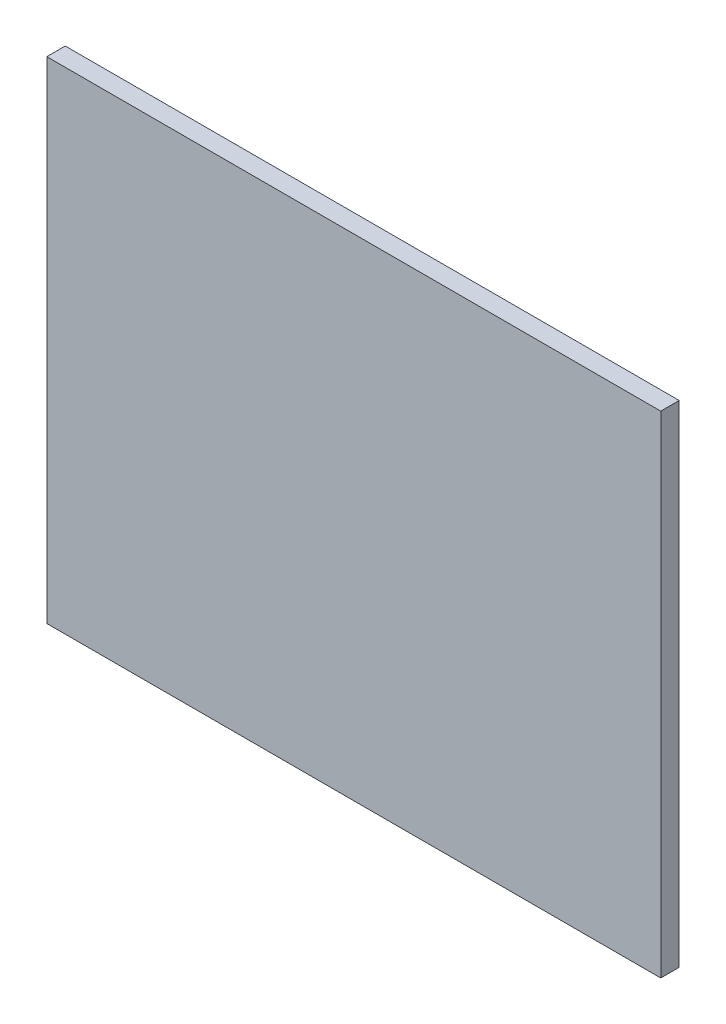
ISO-10303-21;
HEADER;
FILE_DESCRIPTION(('STEP AP214'),'2;1');
FILE_NAME('part.step','',(''),(''),'','','');
FILE_SCHEMA(('AUTOMOTIVE_DESIGN { 1 0 10303 214 1 1 1 1 }'));
ENDSEC;
DATA;
#1=APPLICATION_CONTEXT('core data for automotive mechanical design processes');
#2=APPLICATION_PROTOCOL_DEFINITION('international standard','automotive_design',2000,#1);
#3=PRODUCT_CONTEXT('',#1,'mechanical');
#4=PRODUCT('Part','Part','',(#3));
#5=PRODUCT_RELATED_PRODUCT_CATEGORY('part','',(#4));
#6=PRODUCT_DEFINITION_FORMATION('','',#4);
#7=PRODUCT_DEFINITION_CONTEXT('part definition',#1,'design');
#8=PRODUCT_DEFINITION('design','',#6,#7);
#9=PRODUCT_DEFINITION_SHAPE('','',#8);
#10=(LENGTH_UNIT() NAMED_UNIT(*) SI_UNIT(.MILLI.,.METRE.));
#11=(NAMED_UNIT(*) PLANE_ANGLE_UNIT() SI_UNIT($,.RADIAN.));
#12=(NAMED_UNIT(*) SI_UNIT($,.STERADIAN.) SOLID_ANGLE_UNIT());
#13=UNCERTAINTY_MEASURE_WITH_UNIT(LENGTH_MEASURE(1.E-05),#10,'distance_accuracy_value','');
#14=(GEOMETRIC_REPRESENTATION_CONTEXT(3) GLOBAL_UNCERTAINTY_ASSIGNED_CONTEXT((#13)) GLOBAL_UNIT_ASSIGNED_CONTEXT((#10,
#11,#12)) REPRESENTATION_CONTEXT('',''));
#15=CARTESIAN_POINT('',(0.,0.,0.));
#16=DIRECTION('',(0.,0.,1.));
#17=DIRECTION('',(1.,0.,0.));
#18=AXIS2_PLACEMENT_3D('',#15,#16,#17);
#19=CARTESIAN_POINT('',(0.,0.,3.));
#20=DIRECTION('',(1.,0.,0.));
#21=DIRECTION('',(0.,1.,0.));
#22=AXIS2_PLACEMENT_3D('',#19,#20,#21);
#23=PLANE('',#22);
#24=DIRECTION('',(0.,-1.,0.));
#25=VECTOR('',#24,1.);
#26=CARTESIAN_POINT('',(0.,0.,0.));
#27=LINE('',#26,#25);
#28=CARTESIAN_POINT('',(0.,79.8,0.));
#29=VERTEX_POINT('',#28);
#30=CARTESIAN_POINT('',(0.,0.,0.));
#31=VERTEX_POINT('',#30);
#32=EDGE_CURVE('E98',#29,#31,#27,.T.);
#33=ORIENTED_EDGE('',*,*,#32,.T.);
#34=DIRECTION('',(0.,0.,-1.));
#35=VECTOR('',#34,1.);
#36=CARTESIAN_POINT('',(0.,0.,3.));
#37=LINE('',#36,#35);
#38=CARTESIAN_POINT('',(0.,0.,3.));
#39=VERTEX_POINT('',#38);
#40=EDGE_CURVE('E11',#39,#31,#37,.T.);
#41=ORIENTED_EDGE('',*,*,#40,.F.);
#42=DIRECTION('',(0.,-1.,0.));
#43=VECTOR('',#42,1.);
#44=CARTESIAN_POINT('',(0.,0.,3.));
#45=LINE('',#44,#43);
#46=CARTESIAN_POINT('',(0.,79.8,3.));
#47=VERTEX_POINT('',#46);
#48=EDGE_CURVE('E86',#47,#39,#45,.T.);
#49=ORIENTED_EDGE('',*,*,#48,.F.);
#50=DIRECTION('',(0.,0.,-1.));
#51=VECTOR('',#50,1.);
#52=CARTESIAN_POINT('',(0.,79.8,3.));
#53=LINE('',#52,#51);
#54=EDGE_CURVE('E94',#47,#29,#53,.T.);
#55=ORIENTED_EDGE('',*,*,#54,.T.);
#56=EDGE_LOOP('',(#33,#41,#49,#55));
#57=FACE_BOUND('',#56,.T.);
#58=ADVANCED_FACE('F35',(#57),#23,.F.);
#59=CARTESIAN_POINT('',(0.,0.,3.));
#60=DIRECTION('',(0.,1.,0.));
#61=DIRECTION('',(0.,0.,1.));
#62=AXIS2_PLACEMENT_3D('',#59,#60,#61);
#63=PLANE('',#62);
#64=DIRECTION('',(1.,0.,0.));
#65=VECTOR('',#64,1.);
#66=CARTESIAN_POINT('',(0.,0.,0.));
#67=LINE('',#66,#65);
#68=CARTESIAN_POINT('',(99.8,0.,0.));
#69=VERTEX_POINT('',#68);
#70=EDGE_CURVE('E90',#31,#69,#67,.T.);
#71=ORIENTED_EDGE('',*,*,#70,.T.);
#72=DIRECTION('',(0.,0.,-1.));
#73=VECTOR('',#72,1.);
#74=CARTESIAN_POINT('',(99.8,0.,3.));
#75=LINE('',#74,#73);
#76=CARTESIAN_POINT('',(99.8,0.,3.));
#77=VERTEX_POINT('',#76);
#78=EDGE_CURVE('E43',#77,#69,#75,.T.);
#79=ORIENTED_EDGE('',*,*,#78,.F.);
#80=DIRECTION('',(1.,0.,0.));
#81=VECTOR('',#80,1.);
#82=CARTESIAN_POINT('',(0.,0.,3.));
#83=LINE('',#82,#81);
#84=EDGE_CURVE('E81',#39,#77,#83,.T.);
#85=ORIENTED_EDGE('',*,*,#84,.F.);
#86=ORIENTED_EDGE('',*,*,#40,.T.);
#87=EDGE_LOOP('',(#71,#79,#85,#86));
#88=FACE_BOUND('',#87,.T.);
#89=ADVANCED_FACE('F89',(#88),#63,.F.);
#90=CARTESIAN_POINT('',(99.8,0.,3.));
#91=DIRECTION('',(-1.,0.,0.));
#92=DIRECTION('',(0.,-1.,0.));
#93=AXIS2_PLACEMENT_3D('',#90,#91,#92);
#94=PLANE('',#93);
#95=DIRECTION('',(0.,1.,0.));
#96=VECTOR('',#95,1.);
#97=CARTESIAN_POINT('',(99.8,0.,0.));
#98=LINE('',#97,#96);
#99=CARTESIAN_POINT('',(99.8,79.8,0.));
#100=VERTEX_POINT('',#99);
#101=EDGE_CURVE('E68',#69,#100,#98,.T.);
#102=ORIENTED_EDGE('',*,*,#101,.T.);
#103=DIRECTION('',(0.,0.,-1.));
#104=VECTOR('',#103,1.);
#105=CARTESIAN_POINT('',(99.8,79.8,3.));
#106=LINE('',#105,#104);
#107=CARTESIAN_POINT('',(99.8,79.8,3.));
#108=VERTEX_POINT('',#107);
#109=EDGE_CURVE('E91',#108,#100,#106,.T.);
#110=ORIENTED_EDGE('',*,*,#109,.F.);
#111=DIRECTION('',(0.,1.,0.));
#112=VECTOR('',#111,1.);
#113=CARTESIAN_POINT('',(99.8,0.,3.));
#114=LINE('',#113,#112);
#115=EDGE_CURVE('E84',#77,#108,#114,.T.);
#116=ORIENTED_EDGE('',*,*,#115,.F.);
#117=ORIENTED_EDGE('',*,*,#78,.T.);
#118=EDGE_LOOP('',(#102,#110,#116,#117));
#119=FACE_BOUND('',#118,.T.);
#120=ADVANCED_FACE('F92',(#119),#94,.F.);
#121=CARTESIAN_POINT('',(0.,79.8,3.));
#122=DIRECTION('',(0.,-1.,0.));
#123=DIRECTION('',(0.,0.,-1.));
#124=AXIS2_PLACEMENT_3D('',#121,#122,#123);
#125=PLANE('',#124);
#126=DIRECTION('',(-1.,0.,0.));
#127=VECTOR('',#126,1.);
#128=CARTESIAN_POINT('',(0.,79.8,0.));
#129=LINE('',#128,#127);
#130=EDGE_CURVE('E74',#100,#29,#129,.T.);
#131=ORIENTED_EDGE('',*,*,#130,.T.);
#132=ORIENTED_EDGE('',*,*,#54,.F.);
#133=DIRECTION('',(-1.,0.,0.));
#134=VECTOR('',#133,1.);
#135=CARTESIAN_POINT('',(0.,79.8,3.));
#136=LINE('',#135,#134);
#137=EDGE_CURVE('E51',#108,#47,#136,.T.);
#138=ORIENTED_EDGE('',*,*,#137,.F.);
#139=ORIENTED_EDGE('',*,*,#109,.T.);
#140=EDGE_LOOP('',(#131,#132,#138,#139));
#141=FACE_BOUND('',#140,.T.);
#142=ADVANCED_FACE('F105',(#141),#125,.F.);
#143=CARTESIAN_POINT('',(0.,0.,3.));
#144=DIRECTION('',(0.,0.,-1.));
#145=DIRECTION('',(-1.,0.,0.));
#146=AXIS2_PLACEMENT_3D('',#143,#144,#145);
#147=PLANE('',#146);
#148=ORIENTED_EDGE('',*,*,#48,.T.);
#149=ORIENTED_EDGE('',*,*,#84,.T.);
#150=ORIENTED_EDGE('',*,*,#115,.T.);
#151=ORIENTED_EDGE('',*,*,#137,.T.);
#152=EDGE_LOOP('',(#148,#149,#150,#151));
#153=FACE_BOUND('',#152,.T.);
#154=ADVANCED_FACE('F82',(#153),#147,.F.);
#155=CARTESIAN_POINT('',(0.,0.,0.));
#156=DIRECTION('',(0.,0.,-1.));
#157=DIRECTION('',(-1.,0.,0.));
#158=AXIS2_PLACEMENT_3D('',#155,#156,#157);
#159=PLANE('',#158);
#160=ORIENTED_EDGE('',*,*,#32,.F.);
#161=ORIENTED_EDGE('',*,*,#130,.F.);
#162=ORIENTED_EDGE('',*,*,#101,.F.);
#163=ORIENTED_EDGE('',*,*,#70,.F.);
#164=EDGE_LOOP('',(#160,#161,#162,#163));
#165=FACE_BOUND('',#164,.T.);
#166=ADVANCED_FACE('F108',(#165),#159,.T.);
#167=CLOSED_SHELL('',(#58,#89,#120,#142,#154,#166));
#168=MANIFOLD_SOLID_BREP('B2',#167);
#169=ADVANCED_BREP_SHAPE_REPRESENTATION('',(#18,#168),#14);
#170=SHAPE_DEFINITION_REPRESENTATION(#9,#169);
ENDSEC;
END-ISO-10303-21;
